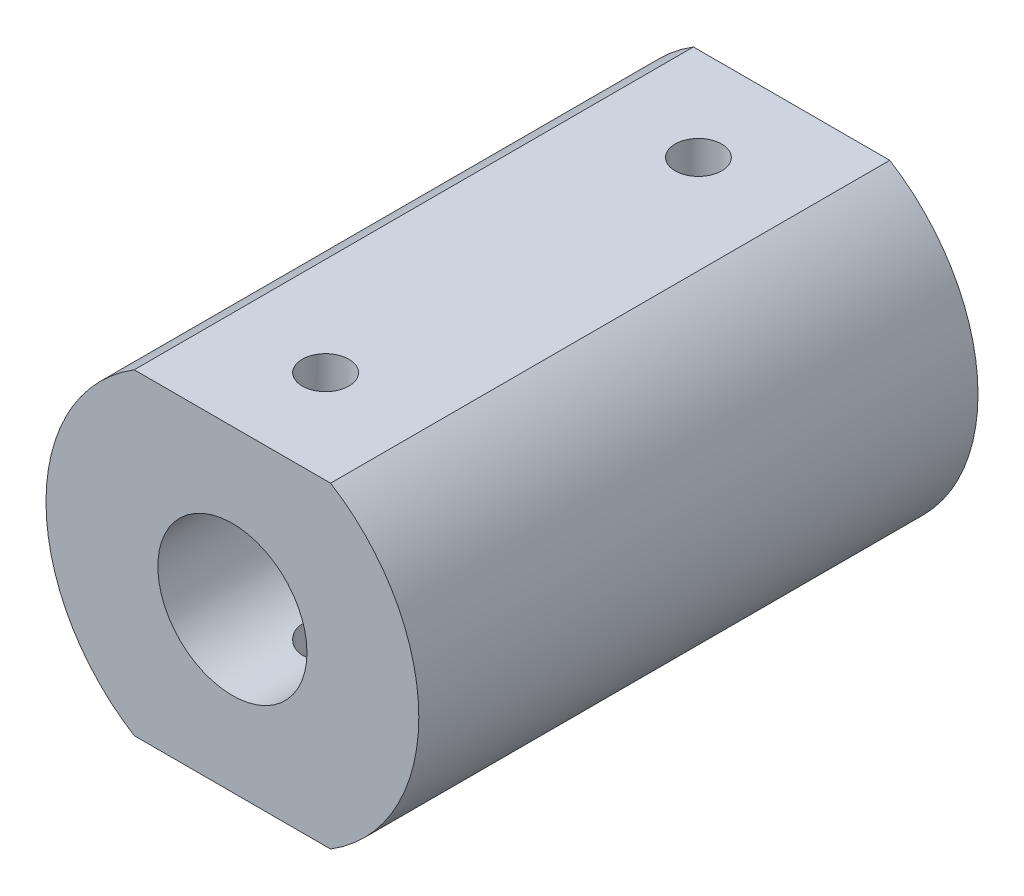
ISO-10303-21;
HEADER;
FILE_DESCRIPTION(('STEP AP214'),'2;1');
FILE_NAME('part.step','',(''),(''),'','','');
FILE_SCHEMA(('AUTOMOTIVE_DESIGN { 1 0 10303 214 1 1 1 1 }'));
ENDSEC;
DATA;
#1=APPLICATION_CONTEXT('core data for automotive mechanical design processes');
#2=APPLICATION_PROTOCOL_DEFINITION('international standard','automotive_design',2000,#1);
#3=PRODUCT_CONTEXT('',#1,'mechanical');
#4=PRODUCT('Part','Part','',(#3));
#5=PRODUCT_RELATED_PRODUCT_CATEGORY('part','',(#4));
#6=PRODUCT_DEFINITION_FORMATION('','',#4);
#7=PRODUCT_DEFINITION_CONTEXT('part definition',#1,'design');
#8=PRODUCT_DEFINITION('design','',#6,#7);
#9=PRODUCT_DEFINITION_SHAPE('','',#8);
#10=(LENGTH_UNIT() NAMED_UNIT(*) SI_UNIT(.MILLI.,.METRE.));
#11=(NAMED_UNIT(*) PLANE_ANGLE_UNIT() SI_UNIT($,.RADIAN.));
#12=(NAMED_UNIT(*) SI_UNIT($,.STERADIAN.) SOLID_ANGLE_UNIT());
#13=UNCERTAINTY_MEASURE_WITH_UNIT(LENGTH_MEASURE(1.E-05),#10,'distance_accuracy_value','');
#14=(GEOMETRIC_REPRESENTATION_CONTEXT(3) GLOBAL_UNCERTAINTY_ASSIGNED_CONTEXT((#13)) GLOBAL_UNIT_ASSIGNED_CONTEXT((#10,
#11,#12)) REPRESENTATION_CONTEXT('',''));
#15=CARTESIAN_POINT('',(0.,0.,0.));
#16=DIRECTION('',(0.,0.,1.));
#17=DIRECTION('',(1.,0.,0.));
#18=AXIS2_PLACEMENT_3D('',#15,#16,#17);
#19=CARTESIAN_POINT('',(0.,0.,60.));
#20=DIRECTION('',(0.,0.,-1.));
#21=DIRECTION('',(-1.,0.,0.));
#22=AXIS2_PLACEMENT_3D('',#19,#20,#21);
#23=CYLINDRICAL_SURFACE('',#22,20.);
#24=CARTESIAN_POINT('',(0.,0.,60.));
#25=DIRECTION('',(0.,0.,1.));
#26=DIRECTION('',(1.,0.,0.));
#27=AXIS2_PLACEMENT_3D('',#24,#25,#26);
#28=CIRCLE('',#27,20.);
#29=CARTESIAN_POINT('',(-10.5356537528527,17.,60.));
#30=VERTEX_POINT('',#29);
#31=CARTESIAN_POINT('',(-10.5356537528527,-17.,60.));
#32=VERTEX_POINT('',#31);
#33=EDGE_CURVE('E99',#30,#32,#28,.T.);
#34=ORIENTED_EDGE('',*,*,#33,.F.);
#35=DIRECTION('',(0.,0.,-1.));
#36=VECTOR('',#35,1.);
#37=CARTESIAN_POINT('',(-10.5356537528527,17.,60.));
#38=LINE('',#37,#36);
#39=CARTESIAN_POINT('',(-10.5356537528527,17.,0.));
#40=VERTEX_POINT('',#39);
#41=EDGE_CURVE('E11',#30,#40,#38,.T.);
#42=ORIENTED_EDGE('',*,*,#41,.T.);
#43=CARTESIAN_POINT('',(0.,0.,0.));
#44=DIRECTION('',(0.,0.,1.));
#45=DIRECTION('',(1.,0.,0.));
#46=AXIS2_PLACEMENT_3D('',#43,#44,#45);
#47=CIRCLE('',#46,20.);
#48=CARTESIAN_POINT('',(-10.5356537528527,-17.,0.));
#49=VERTEX_POINT('',#48);
#50=EDGE_CURVE('E102',#40,#49,#47,.T.);
#51=ORIENTED_EDGE('',*,*,#50,.T.);
#52=DIRECTION('',(0.,0.,-1.));
#53=VECTOR('',#52,1.);
#54=CARTESIAN_POINT('',(-10.5356537528527,-17.,60.));
#55=LINE('',#54,#53);
#56=EDGE_CURVE('E90',#49,#32,#55,.F.);
#57=ORIENTED_EDGE('',*,*,#56,.T.);
#58=EDGE_LOOP('',(#34,#42,#51,#57));
#59=FACE_BOUND('',#58,.T.);
#60=ADVANCED_FACE('F36',(#59),#23,.T.);
#61=CARTESIAN_POINT('',(0.,0.,60.));
#62=DIRECTION('',(0.,0.,1.));
#63=DIRECTION('',(1.,0.,0.));
#64=AXIS2_PLACEMENT_3D('',#61,#62,#63);
#65=PLANE('',#64);
#66=DIRECTION('',(1.,0.,0.));
#67=VECTOR('',#66,1.);
#68=CARTESIAN_POINT('',(-15.2086292755877,17.,60.));
#69=LINE('',#68,#67);
#70=CARTESIAN_POINT('',(10.5356537528527,17.,60.));
#71=VERTEX_POINT('',#70);
#72=EDGE_CURVE('E66',#30,#71,#69,.T.);
#73=ORIENTED_EDGE('',*,*,#72,.F.);
#74=ORIENTED_EDGE('',*,*,#33,.T.);
#75=DIRECTION('',(-1.,0.,0.));
#76=VECTOR('',#75,1.);
#77=CARTESIAN_POINT('',(-26.5951407746183,-17.,60.));
#78=LINE('',#77,#76);
#79=CARTESIAN_POINT('',(10.5356537528527,-17.,60.));
#80=VERTEX_POINT('',#79);
#81=EDGE_CURVE('E58',#80,#32,#78,.T.);
#82=ORIENTED_EDGE('',*,*,#81,.F.);
#83=EDGE_CURVE('E97',#80,#71,#28,.T.);
#84=ORIENTED_EDGE('',*,*,#83,.T.);
#85=EDGE_LOOP('',(#73,#74,#82,#84));
#86=FACE_BOUND('',#85,.T.);
#87=CARTESIAN_POINT('',(0.,0.,60.));
#88=DIRECTION('',(0.,0.,1.));
#89=DIRECTION('',(1.,0.,0.));
#90=AXIS2_PLACEMENT_3D('',#87,#88,#89);
#91=CIRCLE('',#90,8.);
#92=CARTESIAN_POINT('',(8.,0.,60.));
#93=VERTEX_POINT('',#92);
#94=EDGE_CURVE('E111',#93,#93,#91,.T.);
#95=ORIENTED_EDGE('',*,*,#94,.F.);
#96=EDGE_LOOP('',(#95));
#97=FACE_BOUND('',#96,.T.);
#98=ADVANCED_FACE('F95',(#86,#97),#65,.T.);
#99=CARTESIAN_POINT('',(0.,0.,0.));
#100=DIRECTION('',(0.,0.,1.));
#101=DIRECTION('',(1.,0.,0.));
#102=AXIS2_PLACEMENT_3D('',#99,#100,#101);
#103=PLANE('',#102);
#104=ORIENTED_EDGE('',*,*,#50,.F.);
#105=DIRECTION('',(1.,0.,0.));
#106=VECTOR('',#105,1.);
#107=CARTESIAN_POINT('',(-15.2086292755877,17.,0.));
#108=LINE('',#107,#106);
#109=CARTESIAN_POINT('',(10.5356537528527,17.,0.));
#110=VERTEX_POINT('',#109);
#111=EDGE_CURVE('E168',#40,#110,#108,.T.);
#112=ORIENTED_EDGE('',*,*,#111,.T.);
#113=CARTESIAN_POINT('',(10.5356537528527,-17.,0.));
#114=VERTEX_POINT('',#113);
#115=EDGE_CURVE('E105',#114,#110,#47,.T.);
#116=ORIENTED_EDGE('',*,*,#115,.F.);
#117=DIRECTION('',(-1.,0.,0.));
#118=VECTOR('',#117,1.);
#119=CARTESIAN_POINT('',(-26.5951407746183,-17.,0.));
#120=LINE('',#119,#118);
#121=EDGE_CURVE('E85',#114,#49,#120,.T.);
#122=ORIENTED_EDGE('',*,*,#121,.T.);
#123=EDGE_LOOP('',(#104,#112,#116,#122));
#124=FACE_BOUND('',#123,.T.);
#125=CARTESIAN_POINT('',(0.,0.,0.));
#126=DIRECTION('',(0.,0.,1.));
#127=DIRECTION('',(1.,0.,0.));
#128=AXIS2_PLACEMENT_3D('',#125,#126,#127);
#129=CIRCLE('',#128,8.);
#130=CARTESIAN_POINT('',(8.,0.,0.));
#131=VERTEX_POINT('',#130);
#132=EDGE_CURVE('E108',#131,#131,#129,.T.);
#133=ORIENTED_EDGE('',*,*,#132,.T.);
#134=EDGE_LOOP('',(#133));
#135=FACE_BOUND('',#134,.T.);
#136=ADVANCED_FACE('F154',(#124,#135),#103,.F.);
#137=ORIENTED_EDGE('',*,*,#115,.T.);
#138=DIRECTION('',(0.,0.,-1.));
#139=VECTOR('',#138,1.);
#140=CARTESIAN_POINT('',(10.5356537528527,17.,60.));
#141=LINE('',#140,#139);
#142=EDGE_CURVE('E50',#110,#71,#141,.F.);
#143=ORIENTED_EDGE('',*,*,#142,.T.);
#144=ORIENTED_EDGE('',*,*,#83,.F.);
#145=DIRECTION('',(0.,0.,-1.));
#146=VECTOR('',#145,1.);
#147=CARTESIAN_POINT('',(10.5356537528527,-17.,60.));
#148=LINE('',#147,#146);
#149=EDGE_CURVE('E82',#80,#114,#148,.T.);
#150=ORIENTED_EDGE('',*,*,#149,.T.);
#151=EDGE_LOOP('',(#137,#143,#144,#150));
#152=FACE_BOUND('',#151,.T.);
#153=ADVANCED_FACE('F38',(#152),#23,.T.);
#154=CARTESIAN_POINT('',(0.,0.,60.));
#155=DIRECTION('',(0.,0.,-1.));
#156=DIRECTION('',(-1.,0.,0.));
#157=AXIS2_PLACEMENT_3D('',#154,#155,#156);
#158=CYLINDRICAL_SURFACE('',#157,8.);
#159=CARTESIAN_POINT('',(0.,-8.,47.5));
#160=CARTESIAN_POINT('',(-0.136878370349092,-7.9999993175598,47.5000008931752));
#161=CARTESIAN_POINT('',(-0.273766105005717,-7.99645389969682,47.5112784538889));
#162=CARTESIAN_POINT('',(-0.543538419176894,-7.98265788177613,47.5559724830785));
#163=CARTESIAN_POINT('',(-0.676422085451812,-7.97240576399719,47.5893939627287));
#164=CARTESIAN_POINT('',(-0.93425708730161,-7.94631631395819,47.6771387423915));
#165=CARTESIAN_POINT('',(-1.0592203539716,-7.9304876299805,47.7314296893059));
#166=CARTESIAN_POINT('',(-1.29826960469292,-7.89487938322185,47.8592346353567));
#167=CARTESIAN_POINT('',(-1.41235387088976,-7.8750991979981,47.9327516635612));
#168=CARTESIAN_POINT('',(-1.62993066990455,-7.83300427480565,48.0993119840347));
#169=CARTESIAN_POINT('',(-1.73304005631331,-7.81063431853978,48.1928417701222));
#170=CARTESIAN_POINT('',(-1.92239476407398,-7.76620092748417,48.3957367848271));
#171=CARTESIAN_POINT('',(-2.00863694579738,-7.74413755046915,48.5051049549891));
#172=CARTESIAN_POINT('',(-2.16388672966226,-7.70222289396345,48.7398891276162));
#173=CARTESIAN_POINT('',(-2.23241568300257,-7.68243976603592,48.8656349550545));
#174=CARTESIAN_POINT('',(-2.34719482153342,-7.64815603598469,49.1275846299637));
#175=CARTESIAN_POINT('',(-2.39345087543888,-7.63365404257377,49.2637857115879));
#176=CARTESIAN_POINT('',(-2.46096919860066,-7.61215213969002,49.5384561549041));
#177=CARTESIAN_POINT('',(-2.48294220015728,-7.60493945859017,49.6767336872777));
#178=CARTESIAN_POINT('',(-2.50349110073975,-7.59820110281901,49.9551862378238));
#179=CARTESIAN_POINT('',(-2.50207321991543,-7.59867338454669,50.0953607416433));
#180=CARTESIAN_POINT('',(-2.47643649465477,-7.60706378150876,50.367748920538));
#181=CARTESIAN_POINT('',(-2.45312115738765,-7.61468683491898,50.5000582517231));
#182=CARTESIAN_POINT('',(-2.38581626711251,-7.63604051304978,50.7587843130747));
#183=CARTESIAN_POINT('',(-2.341824516891,-7.6497717868623,50.8852004154176));
#184=CARTESIAN_POINT('',(-2.23377749362553,-7.68202088028593,51.1307038888653));
#185=CARTESIAN_POINT('',(-2.16943851324163,-7.70060569321649,51.249657221384));
#186=CARTESIAN_POINT('',(-2.02272041475695,-7.7404371316014,51.4753755357582));
#187=CARTESIAN_POINT('',(-1.94033661043154,-7.76168444789102,51.5821373405074));
#188=CARTESIAN_POINT('',(-1.75543390836424,-7.80563055600986,51.785549886834));
#189=CARTESIAN_POINT('',(-1.65216914118563,-7.82835139211391,51.8815191155594));
#190=CARTESIAN_POINT('',(-1.43072881619105,-7.87183141519161,52.0549437871594));
#191=CARTESIAN_POINT('',(-1.31255215469803,-7.89259045676745,52.1323978584384));
#192=CARTESIAN_POINT('',(-1.0633292209309,-7.93002589780382,52.2670553772025));
#193=CARTESIAN_POINT('',(-0.93218981383855,-7.94666921296415,52.3240962709279));
#194=CARTESIAN_POINT('',(-0.661535955565281,-7.97375911657108,52.4151060017031));
#195=CARTESIAN_POINT('',(-0.522024061449211,-7.98420758650304,52.4490818444768));
#196=CARTESIAN_POINT('',(-0.244370314580686,-7.99742778790027,52.491836085158));
#197=CARTESIAN_POINT('',(-0.106383697577683,-8.00048045790873,52.501537087187));
#198=CARTESIAN_POINT('',(0.169260611465173,-7.99939599461967,52.4980675467253));
#199=CARTESIAN_POINT('',(0.306918348613019,-7.9952599116227,52.4849003453548));
#200=CARTESIAN_POINT('',(0.574438665951698,-7.98044727539523,52.4368088147872));
#201=CARTESIAN_POINT('',(0.704409956841873,-7.96993586221374,52.402433464775));
#202=CARTESIAN_POINT('',(0.956703857722752,-7.94360242758579,52.3135712952666));
#203=CARTESIAN_POINT('',(1.07902552089811,-7.92777975028688,52.25908199195));
#204=CARTESIAN_POINT('',(1.31586481334437,-7.89197085518848,52.1300535669026));
#205=CARTESIAN_POINT('',(1.43011947957558,-7.87189253635336,52.0550580250064));
#206=CARTESIAN_POINT('',(1.64473170192051,-7.82986820006859,51.8876935797651));
#207=CARTESIAN_POINT('',(1.74508547608789,-7.80792167695775,51.7953199645107));
#208=CARTESIAN_POINT('',(1.93317492583803,-7.76353989766283,51.5914822198958));
#209=CARTESIAN_POINT('',(2.02025304679062,-7.74111973412883,51.4794066725215));
#210=CARTESIAN_POINT('',(2.17442500490302,-7.69923894191212,51.2417467672464));
#211=CARTESIAN_POINT('',(2.24151915946858,-7.67977826622621,51.116162623946));
#212=CARTESIAN_POINT('',(2.35340166961084,-7.64623564661738,50.855309654259));
#213=CARTESIAN_POINT('',(2.39827639112024,-7.63213292713749,50.7200807011286));
#214=CARTESIAN_POINT('',(2.46445788636179,-7.61102341688621,50.4434550135027));
#215=CARTESIAN_POINT('',(2.48577362827988,-7.60401392602456,50.3020606473129));
#216=CARTESIAN_POINT('',(2.5035881231625,-7.59816585427754,50.0239918248392));
#217=CARTESIAN_POINT('',(2.5011655924327,-7.59897209200284,49.8873930923052));
#218=CARTESIAN_POINT('',(2.47417636257667,-7.60780180751807,49.6166508301161));
#219=CARTESIAN_POINT('',(2.44961069645023,-7.61582494863208,49.4825071862265));
#220=CARTESIAN_POINT('',(2.37975459827234,-7.6379362836678,49.2224119208162));
#221=CARTESIAN_POINT('',(2.33477284812015,-7.65193396380514,49.0963691178133));
#222=CARTESIAN_POINT('',(2.22560454669998,-7.68439408509128,48.853519172932));
#223=CARTESIAN_POINT('',(2.16141408888472,-7.70285743429344,48.7367139158432));
#224=CARTESIAN_POINT('',(2.01271350026985,-7.74306974067006,48.5107080591204));
#225=CARTESIAN_POINT('',(1.92750667048263,-7.76491897845914,48.4019837409995));
#226=CARTESIAN_POINT('',(1.74041799280959,-7.8089799764242,48.200027343776));
#227=CARTESIAN_POINT('',(1.63853168468877,-7.83119183213309,48.1067994220179));
#228=CARTESIAN_POINT('',(1.41697332564668,-7.87434543904947,47.9354349232741));
#229=CARTESIAN_POINT('',(1.29682914897476,-7.89522203461346,47.8578905271001));
#230=CARTESIAN_POINT('',(1.04455827602729,-7.93253538593756,47.7242021697211));
#231=CARTESIAN_POINT('',(0.912436315590892,-7.94897388631644,47.6680497957163));
#232=CARTESIAN_POINT('',(0.651495270747954,-7.97441301466941,47.5828172647831));
#233=CARTESIAN_POINT('',(0.523340674225089,-7.98392481612283,47.5518502653893));
#234=CARTESIAN_POINT('',(0.263459790880493,-7.99671800680967,47.5104432800646));
#235=CARTESIAN_POINT('',(0.131734232279349,-8.00000065679286,47.499999140392));
#236=CARTESIAN_POINT('',(0.,-8.,47.5));
#237=B_SPLINE_CURVE_WITH_KNOTS('',3,(#159,#160,#161,#162,#163,#164,#165,#166,#167,#168,#169,
#170,#171,#172,#173,#174,#175,#176,#177,#178,#179,#180,#181,#182,#183,#184,#185,#186,#187,#188,
#189,#190,#191,#192,#193,#194,#195,#196,#197,#198,#199,#200,#201,#202,#203,#204,#205,#206,#207,
#208,#209,#210,#211,#212,#213,#214,#215,#216,#217,#218,#219,#220,#221,#222,#223,#224,#225,#226,
#227,#228,#229,#230,#231,#232,#233,#234,#235,#236),.UNSPECIFIED.,.T.,.F.,(4,2,2,2,2,2,2,2,2,2,2,
2,2,2,2,2,2,2,2,2,2,2,2,2,2,2,2,2,2,2,2,2,2,2,2,2,2,2,4),(0.,0.410150898865018,0.82039464669813,
1.23000495840487,1.63967984311678,2.06075644390316,2.48191134862551,2.91347542494986,
3.34492572559053,3.76338300334419,4.18172900590275,4.58353834844336,4.98539039958124,
5.39311285441088,5.80094132020714,6.22733494559198,6.65376014826604,7.08350921379538,
7.51312768989105,7.92615137096472,8.33911471298723,8.74181253445741,9.14456010068996,
9.55712649476682,9.96980491418515,10.3988355742628,10.8278594196742,11.2552023150671,
11.6823824779468,12.0902440696665,12.4980866352126,12.8999582681243,13.3019116867944,
13.7195902803181,14.1373807476577,14.5688133627191,15.0000761335176,15.3948927332217,
15.7896294154518),.UNSPECIFIED.);
#238=CARTESIAN_POINT('',(0.,-8.,47.5));
#239=VERTEX_POINT('',#238);
#240=EDGE_CURVE('E40',#239,#239,#237,.T.);
#241=ORIENTED_EDGE('',*,*,#240,.F.);
#242=EDGE_LOOP('',(#241));
#243=FACE_BOUND('',#242,.T.);
#244=CARTESIAN_POINT('',(0.,-8.,27.5));
#245=CARTESIAN_POINT('',(-0.136878370349092,-7.9999993175598,27.5000008931752));
#246=CARTESIAN_POINT('',(-0.273766105005718,-7.99645389969682,27.5112784538889));
#247=CARTESIAN_POINT('',(-0.543538419176894,-7.98265788177613,27.5559724830785));
#248=CARTESIAN_POINT('',(-0.676422085451812,-7.97240576399719,27.5893939627287));
#249=CARTESIAN_POINT('',(-0.934257087301609,-7.94631631395819,27.6771387423915));
#250=CARTESIAN_POINT('',(-1.0592203539716,-7.9304876299805,27.7314296893059));
#251=CARTESIAN_POINT('',(-1.29826960469291,-7.89487938322185,27.8592346353567));
#252=CARTESIAN_POINT('',(-1.41235387088976,-7.8750991979981,27.9327516635612));
#253=CARTESIAN_POINT('',(-1.62993066990455,-7.83300427480565,28.0993119840347));
#254=CARTESIAN_POINT('',(-1.73304005631331,-7.81063431853978,28.1928417701222));
#255=CARTESIAN_POINT('',(-1.92239476407398,-7.76620092748417,28.3957367848271));
#256=CARTESIAN_POINT('',(-2.00863694579738,-7.74413755046915,28.5051049549891));
#257=CARTESIAN_POINT('',(-2.16388672966226,-7.70222289396345,28.7398891276162));
#258=CARTESIAN_POINT('',(-2.23241568300257,-7.68243976603592,28.8656349550544));
#259=CARTESIAN_POINT('',(-2.34719482153342,-7.64815603598469,29.1275846299637));
#260=CARTESIAN_POINT('',(-2.39345087543888,-7.63365404257377,29.2637857115879));
#261=CARTESIAN_POINT('',(-2.46096919860066,-7.61215213969002,29.5384561549041));
#262=CARTESIAN_POINT('',(-2.48294220015728,-7.60493945859017,29.6767336872777));
#263=CARTESIAN_POINT('',(-2.50349110073975,-7.59820110281901,29.9551862378238));
#264=CARTESIAN_POINT('',(-2.50207321991543,-7.59867338454669,30.0953607416433));
#265=CARTESIAN_POINT('',(-2.47643649465478,-7.60706378150876,30.367748920538));
#266=CARTESIAN_POINT('',(-2.45312115738765,-7.61468683491897,30.5000582517231));
#267=CARTESIAN_POINT('',(-2.38581626711251,-7.63604051304978,30.7587843130747));
#268=CARTESIAN_POINT('',(-2.341824516891,-7.6497717868623,30.8852004154176));
#269=CARTESIAN_POINT('',(-2.23377749362554,-7.68202088028593,31.1307038888653));
#270=CARTESIAN_POINT('',(-2.16943851324163,-7.70060569321649,31.249657221384));
#271=CARTESIAN_POINT('',(-2.02272041475696,-7.7404371316014,31.4753755357582));
#272=CARTESIAN_POINT('',(-1.94033661043154,-7.76168444789102,31.5821373405074));
#273=CARTESIAN_POINT('',(-1.75543390836424,-7.80563055600986,31.785549886834));
#274=CARTESIAN_POINT('',(-1.65216914118563,-7.82835139211391,31.8815191155594));
#275=CARTESIAN_POINT('',(-1.43072881619105,-7.87183141519161,32.0549437871594));
#276=CARTESIAN_POINT('',(-1.31255215469803,-7.89259045676745,32.1323978584384));
#277=CARTESIAN_POINT('',(-1.0633292209309,-7.93002589780382,32.2670553772025));
#278=CARTESIAN_POINT('',(-0.932189813838554,-7.94666921296415,32.3240962709279));
#279=CARTESIAN_POINT('',(-0.661535955565285,-7.97375911657108,32.4151060017031));
#280=CARTESIAN_POINT('',(-0.522024061449214,-7.98420758650304,32.4490818444768));
#281=CARTESIAN_POINT('',(-0.244370314580688,-7.99742778790027,32.4918360851579));
#282=CARTESIAN_POINT('',(-0.106383697577685,-8.00048045790873,32.501537087187));
#283=CARTESIAN_POINT('',(0.169260611465171,-7.99939599461967,32.4980675467253));
#284=CARTESIAN_POINT('',(0.306918348613017,-7.9952599116227,32.4849003453548));
#285=CARTESIAN_POINT('',(0.574438665951695,-7.98044727539523,32.4368088147872));
#286=CARTESIAN_POINT('',(0.70440995684187,-7.96993586221374,32.402433464775));
#287=CARTESIAN_POINT('',(0.95670385772275,-7.94360242758579,32.3135712952666));
#288=CARTESIAN_POINT('',(1.07902552089811,-7.92777975028688,32.25908199195));
#289=CARTESIAN_POINT('',(1.31586481334437,-7.89197085518848,32.1300535669026));
#290=CARTESIAN_POINT('',(1.43011947957558,-7.87189253635335,32.0550580250064));
#291=CARTESIAN_POINT('',(1.64473170192051,-7.82986820006859,31.8876935797651));
#292=CARTESIAN_POINT('',(1.74508547608789,-7.80792167695775,31.7953199645107));
#293=CARTESIAN_POINT('',(1.93317492583803,-7.76353989766283,31.5914822198958));
#294=CARTESIAN_POINT('',(2.02025304679062,-7.74111973412883,31.4794066725215));
#295=CARTESIAN_POINT('',(2.17442500490302,-7.69923894191212,31.2417467672464));
#296=CARTESIAN_POINT('',(2.24151915946858,-7.67977826622621,31.116162623946));
#297=CARTESIAN_POINT('',(2.35340166961084,-7.64623564661738,30.855309654259));
#298=CARTESIAN_POINT('',(2.39827639112024,-7.63213292713749,30.7200807011286));
#299=CARTESIAN_POINT('',(2.46445788636179,-7.61102341688621,30.4434550135028));
#300=CARTESIAN_POINT('',(2.48577362827988,-7.60401392602456,30.3020606473129));
#301=CARTESIAN_POINT('',(2.5035881231625,-7.59816585427754,30.0239918248391));
#302=CARTESIAN_POINT('',(2.5011655924327,-7.59897209200284,29.8873930923052));
#303=CARTESIAN_POINT('',(2.47417636257667,-7.60780180751807,29.6166508301161));
#304=CARTESIAN_POINT('',(2.44961069645023,-7.61582494863208,29.4825071862265));
#305=CARTESIAN_POINT('',(2.37975459827234,-7.6379362836678,29.2224119208162));
#306=CARTESIAN_POINT('',(2.33477284812016,-7.65193396380514,29.0963691178133));
#307=CARTESIAN_POINT('',(2.22560454669998,-7.68439408509128,28.853519172932));
#308=CARTESIAN_POINT('',(2.16141408888473,-7.70285743429343,28.7367139158432));
#309=CARTESIAN_POINT('',(2.01271350026986,-7.74306974067006,28.5107080591204));
#310=CARTESIAN_POINT('',(1.92750667048264,-7.76491897845914,28.4019837409995));
#311=CARTESIAN_POINT('',(1.74041799280959,-7.8089799764242,28.200027343776));
#312=CARTESIAN_POINT('',(1.63853168468877,-7.83119183213309,28.1067994220179));
#313=CARTESIAN_POINT('',(1.41697332564669,-7.87434543904947,27.9354349232741));
#314=CARTESIAN_POINT('',(1.29682914897476,-7.89522203461346,27.8578905271001));
#315=CARTESIAN_POINT('',(1.0445582760273,-7.93253538593756,27.7242021697211));
#316=CARTESIAN_POINT('',(0.912436315590893,-7.94897388631644,27.6680497957163));
#317=CARTESIAN_POINT('',(0.651495270747953,-7.97441301466941,27.5828172647831));
#318=CARTESIAN_POINT('',(0.523340674225089,-7.98392481612283,27.5518502653893));
#319=CARTESIAN_POINT('',(0.263459790880493,-7.99671800680967,27.5104432800646));
#320=CARTESIAN_POINT('',(0.131734232279348,-8.00000065679286,27.499999140392));
#321=CARTESIAN_POINT('',(0.,-8.,27.5));
#322=B_SPLINE_CURVE_WITH_KNOTS('',3,(#244,#245,#246,#247,#248,#249,#250,#251,#252,#253,#254,
#255,#256,#257,#258,#259,#260,#261,#262,#263,#264,#265,#266,#267,#268,#269,#270,#271,#272,#273,
#274,#275,#276,#277,#278,#279,#280,#281,#282,#283,#284,#285,#286,#287,#288,#289,#290,#291,#292,
#293,#294,#295,#296,#297,#298,#299,#300,#301,#302,#303,#304,#305,#306,#307,#308,#309,#310,#311,
#312,#313,#314,#315,#316,#317,#318,#319,#320,#321),.UNSPECIFIED.,.T.,.F.,(4,2,2,2,2,2,2,2,2,2,2,
2,2,2,2,2,2,2,2,2,2,2,2,2,2,2,2,2,2,2,2,2,2,2,2,2,2,2,4),(0.,0.410150898865018,
0.820394646698129,1.23000495840487,1.63967984311677,2.06075644390316,2.48191134862551,
2.91347542494987,3.34492572559053,3.76338300334418,4.18172900590275,4.58353834844336,
4.98539039958124,5.39311285441088,5.80094132020714,6.22733494559198,6.65376014826604,
7.08350921379537,7.51312768989105,7.92615137096471,8.33911471298722,8.7418125344574,
9.14456010068996,9.55712649476683,9.96980491418514,10.3988355742628,10.8278594196742,
11.2552023150671,11.6823824779467,12.0902440696665,12.4980866352126,12.8999582681243,
13.3019116867944,13.7195902803181,14.1373807476577,14.5688133627191,15.0000761335176,
15.3948927332217,15.7896294154518),.UNSPECIFIED.);
#323=CARTESIAN_POINT('',(0.,-8.,27.5));
#324=VERTEX_POINT('',#323);
#325=EDGE_CURVE('E179',#324,#324,#322,.T.);
#326=ORIENTED_EDGE('',*,*,#325,.F.);
#327=EDGE_LOOP('',(#326));
#328=FACE_BOUND('',#327,.T.);
#329=CARTESIAN_POINT('',(0.,8.,52.5));
#330=CARTESIAN_POINT('',(-0.136878370349092,7.9999993175598,52.4999991068248));
#331=CARTESIAN_POINT('',(-0.273766105005717,7.99645389969682,52.4887215461111));
#332=CARTESIAN_POINT('',(-0.543538419176894,7.98265788177613,52.4440275169215));
#333=CARTESIAN_POINT('',(-0.676422085451812,7.97240576399719,52.4106060372713));
#334=CARTESIAN_POINT('',(-0.934257087301611,7.94631631395819,52.3228612576085));
#335=CARTESIAN_POINT('',(-1.0592203539716,7.9304876299805,52.2685703106941));
#336=CARTESIAN_POINT('',(-1.29826960469292,7.89487938322185,52.1407653646433));
#337=CARTESIAN_POINT('',(-1.41235387088976,7.8750991979981,52.0672483364388));
#338=CARTESIAN_POINT('',(-1.62993066990456,7.83300427480565,51.9006880159653));
#339=CARTESIAN_POINT('',(-1.73304005631331,7.81063431853978,51.8071582298778));
#340=CARTESIAN_POINT('',(-1.92239476407398,7.76620092748417,51.6042632151729));
#341=CARTESIAN_POINT('',(-2.00863694579739,7.74413755046915,51.4948950450109));
#342=CARTESIAN_POINT('',(-2.16388672966227,7.70222289396345,51.2601108723838));
#343=CARTESIAN_POINT('',(-2.23241568300258,7.68243976603591,51.1343650449455));
#344=CARTESIAN_POINT('',(-2.34719482153343,7.64815603598469,50.8724153700362));
#345=CARTESIAN_POINT('',(-2.39345087543889,7.63365404257377,50.7362142884121));
#346=CARTESIAN_POINT('',(-2.46096919860066,7.61215213969002,50.4615438450959));
#347=CARTESIAN_POINT('',(-2.48294220015729,7.60493945859017,50.3232663127223));
#348=CARTESIAN_POINT('',(-2.50349110073976,7.59820110281901,50.0448137621762));
#349=CARTESIAN_POINT('',(-2.50207321991543,7.59867338454669,49.9046392583567));
#350=CARTESIAN_POINT('',(-2.47643649465478,7.60706378150876,49.632251079462));
#351=CARTESIAN_POINT('',(-2.45312115738765,7.61468683491897,49.4999417482769));
#352=CARTESIAN_POINT('',(-2.38581626711252,7.63604051304978,49.2412156869253));
#353=CARTESIAN_POINT('',(-2.341824516891,7.6497717868623,49.1147995845824));
#354=CARTESIAN_POINT('',(-2.23377749362554,7.68202088028593,48.8692961111347));
#355=CARTESIAN_POINT('',(-2.16943851324163,7.70060569321649,48.750342778616));
#356=CARTESIAN_POINT('',(-2.02272041475696,7.7404371316014,48.5246244642418));
#357=CARTESIAN_POINT('',(-1.94033661043154,7.76168444789102,48.4178626594926));
#358=CARTESIAN_POINT('',(-1.75543390836425,7.80563055600986,48.214450113166));
#359=CARTESIAN_POINT('',(-1.65216914118563,7.82835139211391,48.1184808844406));
#360=CARTESIAN_POINT('',(-1.43072881619106,7.87183141519161,47.9450562128406));
#361=CARTESIAN_POINT('',(-1.31255215469804,7.89259045676745,47.8676021415616));
#362=CARTESIAN_POINT('',(-1.06332922093091,7.93002589780382,47.7329446227975));
#363=CARTESIAN_POINT('',(-0.932189813838558,7.94666921296415,47.6759037290721));
#364=CARTESIAN_POINT('',(-0.661535955565288,7.97375911657108,47.5848939982969));
#365=CARTESIAN_POINT('',(-0.522024061449216,7.98420758650304,47.5509181555232));
#366=CARTESIAN_POINT('',(-0.24437031458069,7.99742778790027,47.508163914842));
#367=CARTESIAN_POINT('',(-0.106383697577687,8.00048045790873,47.4984629128129));
#368=CARTESIAN_POINT('',(0.169260611465169,7.99939599461967,47.5019324532747));
#369=CARTESIAN_POINT('',(0.306918348613015,7.9952599116227,47.5150996546452));
#370=CARTESIAN_POINT('',(0.574438665951694,7.98044727539523,47.5631911852128));
#371=CARTESIAN_POINT('',(0.704409956841869,7.96993586221374,47.597566535225));
#372=CARTESIAN_POINT('',(0.956703857722749,7.94360242758579,47.6864287047334));
#373=CARTESIAN_POINT('',(1.07902552089811,7.92777975028688,47.74091800805));
#374=CARTESIAN_POINT('',(1.31586481334437,7.89197085518848,47.8699464330974));
#375=CARTESIAN_POINT('',(1.43011947957558,7.87189253635335,47.9449419749936));
#376=CARTESIAN_POINT('',(1.64473170192051,7.82986820006859,48.1123064202348));
#377=CARTESIAN_POINT('',(1.74508547608789,7.80792167695775,48.2046800354893));
#378=CARTESIAN_POINT('',(1.93317492583803,7.76353989766283,48.4085177801042));
#379=CARTESIAN_POINT('',(2.02025304679062,7.74111973412883,48.5205933274784));
#380=CARTESIAN_POINT('',(2.17442500490302,7.69923894191212,48.7582532327535));
#381=CARTESIAN_POINT('',(2.24151915946859,7.67977826622621,48.883837376054));
#382=CARTESIAN_POINT('',(2.35340166961084,7.64623564661738,49.1446903457409));
#383=CARTESIAN_POINT('',(2.39827639112024,7.63213292713749,49.2799192988714));
#384=CARTESIAN_POINT('',(2.4644578863618,7.6110234168862,49.5565449864972));
#385=CARTESIAN_POINT('',(2.48577362827988,7.60401392602456,49.6979393526871));
#386=CARTESIAN_POINT('',(2.50358812316251,7.59816585427754,49.9760081751609));
#387=CARTESIAN_POINT('',(2.50116559243271,7.59897209200284,50.1126069076948));
#388=CARTESIAN_POINT('',(2.47417636257667,7.60780180751807,50.3833491698839));
#389=CARTESIAN_POINT('',(2.44961069645024,7.61582494863208,50.5174928137735));
#390=CARTESIAN_POINT('',(2.37975459827234,7.6379362836678,50.7775880791838));
#391=CARTESIAN_POINT('',(2.33477284812016,7.65193396380514,50.9036308821867));
#392=CARTESIAN_POINT('',(2.22560454669998,7.68439408509128,51.146480827068));
#393=CARTESIAN_POINT('',(2.16141408888473,7.70285743429343,51.2632860841568));
#394=CARTESIAN_POINT('',(2.01271350026986,7.74306974067005,51.4892919408796));
#395=CARTESIAN_POINT('',(1.92750667048264,7.76491897845914,51.5980162590005));
#396=CARTESIAN_POINT('',(1.74041799280959,7.8089799764242,51.799972656224));
#397=CARTESIAN_POINT('',(1.63853168468877,7.83119183213309,51.8932005779821));
#398=CARTESIAN_POINT('',(1.41697332564669,7.87434543904947,52.0645650767259));
#399=CARTESIAN_POINT('',(1.29682914897476,7.89522203461346,52.1421094728999));
#400=CARTESIAN_POINT('',(1.0445582760273,7.93253538593756,52.2757978302789));
#401=CARTESIAN_POINT('',(0.912436315590893,7.94897388631644,52.3319502042837));
#402=CARTESIAN_POINT('',(0.651495270747954,7.97441301466941,52.4171827352169));
#403=CARTESIAN_POINT('',(0.52334067422509,7.98392481612283,52.4481497346107));
#404=CARTESIAN_POINT('',(0.263459790880494,7.99671800680967,52.4895567199354));
#405=CARTESIAN_POINT('',(0.131734232279349,8.00000065679286,52.500000859608));
#406=CARTESIAN_POINT('',(0.,8.,52.5));
#407=B_SPLINE_CURVE_WITH_KNOTS('',3,(#329,#330,#331,#332,#333,#334,#335,#336,#337,#338,#339,
#340,#341,#342,#343,#344,#345,#346,#347,#348,#349,#350,#351,#352,#353,#354,#355,#356,#357,#358,
#359,#360,#361,#362,#363,#364,#365,#366,#367,#368,#369,#370,#371,#372,#373,#374,#375,#376,#377,
#378,#379,#380,#381,#382,#383,#384,#385,#386,#387,#388,#389,#390,#391,#392,#393,#394,#395,#396,
#397,#398,#399,#400,#401,#402,#403,#404,#405,#406),.UNSPECIFIED.,.T.,.F.,(4,2,2,2,2,2,2,2,2,2,2,
2,2,2,2,2,2,2,2,2,2,2,2,2,2,2,2,2,2,2,2,2,2,2,2,2,2,2,4),(0.,0.410150898865018,0.82039464669813,
1.23000495840487,1.63967984311678,2.06075644390316,2.48191134862552,2.91347542494989,
3.34492572559053,3.7633830033442,4.18172900590276,4.58353834844337,4.98539039958124,
5.39311285441088,5.80094132020715,6.22733494559199,6.65376014826604,7.08350921379539,
7.51312768989106,7.92615137096473,8.33911471298724,8.74181253445742,9.14456010068997,
9.55712649476684,9.96980491418516,10.3988355742628,10.8278594196742,11.2552023150671,
11.6823824779468,12.0902440696666,12.4980866352126,12.8999582681244,13.3019116867944,
13.7195902803182,14.1373807476577,14.5688133627192,15.0000761335177,15.3948927332217,
15.7896294154519),.UNSPECIFIED.);
#408=CARTESIAN_POINT('',(0.,8.,52.5));
#409=VERTEX_POINT('',#408);
#410=EDGE_CURVE('E121',#409,#409,#407,.T.);
#411=ORIENTED_EDGE('',*,*,#410,.F.);
#412=EDGE_LOOP('',(#411));
#413=FACE_BOUND('',#412,.T.);
#414=CARTESIAN_POINT('',(0.,8.,12.5));
#415=CARTESIAN_POINT('',(-0.136878370349093,7.9999993175598,12.4999991068249));
#416=CARTESIAN_POINT('',(-0.273766105005718,7.99645389969682,12.4887215461111));
#417=CARTESIAN_POINT('',(-0.543538419176895,7.98265788177613,12.4440275169215));
#418=CARTESIAN_POINT('',(-0.676422085451813,7.97240576399719,12.4106060372713));
#419=CARTESIAN_POINT('',(-0.934257087301611,7.94631631395819,12.3228612576085));
#420=CARTESIAN_POINT('',(-1.05922035397161,7.9304876299805,12.2685703106941));
#421=CARTESIAN_POINT('',(-1.29826960469292,7.89487938322185,12.1407653646433));
#422=CARTESIAN_POINT('',(-1.41235387088977,7.8750991979981,12.0672483364388));
#423=CARTESIAN_POINT('',(-1.62993066990456,7.83300427480565,11.9006880159653));
#424=CARTESIAN_POINT('',(-1.73304005631332,7.81063431853978,11.8071582298779));
#425=CARTESIAN_POINT('',(-1.92239476407398,7.76620092748417,11.6042632151729));
#426=CARTESIAN_POINT('',(-2.00863694579739,7.74413755046915,11.4948950450109));
#427=CARTESIAN_POINT('',(-2.16388672966227,7.70222289396345,11.2601108723838));
#428=CARTESIAN_POINT('',(-2.23241568300257,7.68243976603592,11.1343650449456));
#429=CARTESIAN_POINT('',(-2.34719482153343,7.64815603598469,10.8724153700363));
#430=CARTESIAN_POINT('',(-2.39345087543889,7.63365404257377,10.7362142884121));
#431=CARTESIAN_POINT('',(-2.46096919860066,7.61215213969002,10.4615438450959));
#432=CARTESIAN_POINT('',(-2.48294220015729,7.60493945859017,10.3232663127223));
#433=CARTESIAN_POINT('',(-2.50349110073976,7.59820110281901,10.0448137621762));
#434=CARTESIAN_POINT('',(-2.50207321991543,7.59867338454669,9.90463925835668));
#435=CARTESIAN_POINT('',(-2.47643649465478,7.60706378150876,9.63225107946204));
#436=CARTESIAN_POINT('',(-2.45312115738765,7.61468683491897,9.49994174827688));
#437=CARTESIAN_POINT('',(-2.38581626711251,7.63604051304978,9.24121568692532));
#438=CARTESIAN_POINT('',(-2.341824516891,7.6497717868623,9.11479958458241));
#439=CARTESIAN_POINT('',(-2.23377749362554,7.68202088028593,8.86929611113474));
#440=CARTESIAN_POINT('',(-2.16943851324163,7.70060569321649,8.75034277861605));
#441=CARTESIAN_POINT('',(-2.02272041475696,7.7404371316014,8.52462446424176));
#442=CARTESIAN_POINT('',(-1.94033661043154,7.76168444789102,8.41786265949259));
#443=CARTESIAN_POINT('',(-1.75543390836424,7.80563055600986,8.21445011316603));
#444=CARTESIAN_POINT('',(-1.65216914118563,7.82835139211391,8.11848088444065));
#445=CARTESIAN_POINT('',(-1.43072881619106,7.87183141519161,7.94505621284065));
#446=CARTESIAN_POINT('',(-1.31255215469804,7.89259045676745,7.8676021415616));
#447=CARTESIAN_POINT('',(-1.0633292209309,7.93002589780382,7.73294462279746));
#448=CARTESIAN_POINT('',(-0.932189813838555,7.94666921296415,7.67590372907207));
#449=CARTESIAN_POINT('',(-0.661535955565286,7.97375911657108,7.58489399829688));
#450=CARTESIAN_POINT('',(-0.522024061449214,7.98420758650304,7.55091815552322));
#451=CARTESIAN_POINT('',(-0.244370314580688,7.99742778790027,7.50816391484205));
#452=CARTESIAN_POINT('',(-0.106383697577684,8.00048045790873,7.49846291281296));
#453=CARTESIAN_POINT('',(0.169260611465173,7.99939599461967,7.50193245327468));
#454=CARTESIAN_POINT('',(0.306918348613018,7.9952599116227,7.51509965464524));
#455=CARTESIAN_POINT('',(0.574438665951698,7.98044727539523,7.56319118521279));
#456=CARTESIAN_POINT('',(0.704409956841873,7.96993586221374,7.59756653522499));
#457=CARTESIAN_POINT('',(0.956703857722753,7.94360242758579,7.68642870473345));
#458=CARTESIAN_POINT('',(1.07902552089812,7.92777975028687,7.74091800805004));
#459=CARTESIAN_POINT('',(1.31586481334437,7.89197085518848,7.86994643309739));
#460=CARTESIAN_POINT('',(1.43011947957558,7.87189253635335,7.94494197499364));
#461=CARTESIAN_POINT('',(1.64473170192052,7.82986820006859,8.11230642023486));
#462=CARTESIAN_POINT('',(1.7450854760879,7.80792167695774,8.2046800354893));
#463=CARTESIAN_POINT('',(1.93317492583803,7.76353989766283,8.40851778010421));
#464=CARTESIAN_POINT('',(2.02025304679062,7.74111973412883,8.52059332747846));
#465=CARTESIAN_POINT('',(2.17442500490302,7.69923894191212,8.75825323275356));
#466=CARTESIAN_POINT('',(2.24151915946859,7.67977826622621,8.88383737605398));
#467=CARTESIAN_POINT('',(2.35340166961084,7.64623564661738,9.14469034574097));
#468=CARTESIAN_POINT('',(2.39827639112025,7.63213292713749,9.27991929887146));
#469=CARTESIAN_POINT('',(2.4644578863618,7.6110234168862,9.55654498649725));
#470=CARTESIAN_POINT('',(2.48577362827989,7.60401392602456,9.69793935268708));
#471=CARTESIAN_POINT('',(2.50358812316251,7.59816585427754,9.97600817516087));
#472=CARTESIAN_POINT('',(2.50116559243271,7.59897209200284,10.1126069076948));
#473=CARTESIAN_POINT('',(2.47417636257667,7.60780180751807,10.3833491698839));
#474=CARTESIAN_POINT('',(2.44961069645024,7.61582494863208,10.5174928137735));
#475=CARTESIAN_POINT('',(2.37975459827234,7.6379362836678,10.7775880791838));
#476=CARTESIAN_POINT('',(2.33477284812016,7.65193396380514,10.9036308821867));
#477=CARTESIAN_POINT('',(2.22560454669998,7.68439408509128,11.146480827068));
#478=CARTESIAN_POINT('',(2.16141408888473,7.70285743429343,11.2632860841568));
#479=CARTESIAN_POINT('',(2.01271350026986,7.74306974067005,11.4892919408796));
#480=CARTESIAN_POINT('',(1.92750667048264,7.76491897845913,11.5980162590005));
#481=CARTESIAN_POINT('',(1.74041799280959,7.8089799764242,11.799972656224));
#482=CARTESIAN_POINT('',(1.63853168468877,7.83119183213309,11.8932005779821));
#483=CARTESIAN_POINT('',(1.41697332564669,7.87434543904947,12.0645650767259));
#484=CARTESIAN_POINT('',(1.29682914897476,7.89522203461346,12.1421094728999));
#485=CARTESIAN_POINT('',(1.0445582760273,7.93253538593756,12.2757978302789));
#486=CARTESIAN_POINT('',(0.912436315590892,7.94897388631644,12.3319502042837));
#487=CARTESIAN_POINT('',(0.651495270747953,7.97441301466941,12.4171827352169));
#488=CARTESIAN_POINT('',(0.523340674225089,7.98392481612283,12.4481497346107));
#489=CARTESIAN_POINT('',(0.263459790880493,7.99671800680967,12.4895567199354));
#490=CARTESIAN_POINT('',(0.131734232279348,8.00000065679286,12.500000859608));
#491=CARTESIAN_POINT('',(0.,8.,12.5));
#492=B_SPLINE_CURVE_WITH_KNOTS('',3,(#414,#415,#416,#417,#418,#419,#420,#421,#422,#423,#424,
#425,#426,#427,#428,#429,#430,#431,#432,#433,#434,#435,#436,#437,#438,#439,#440,#441,#442,#443,
#444,#445,#446,#447,#448,#449,#450,#451,#452,#453,#454,#455,#456,#457,#458,#459,#460,#461,#462,
#463,#464,#465,#466,#467,#468,#469,#470,#471,#472,#473,#474,#475,#476,#477,#478,#479,#480,#481,
#482,#483,#484,#485,#486,#487,#488,#489,#490,#491),.UNSPECIFIED.,.T.,.F.,(4,2,2,2,2,2,2,2,2,2,2,
2,2,2,2,2,2,2,2,2,2,2,2,2,2,2,2,2,2,2,2,2,2,2,2,2,2,2,4),(0.,0.410150898865019,
0.820394646698131,1.23000495840487,1.63967984311678,2.06075644390316,2.48191134862552,
2.91347542494987,3.34492572559053,3.76338300334419,4.18172900590276,4.58353834844337,
4.98539039958125,5.39311285441089,5.80094132020716,6.22733494559199,6.65376014826605,
7.08350921379539,7.51312768989106,7.92615137096473,8.33911471298724,8.74181253445742,
9.14456010068998,9.55712649476684,9.96980491418517,10.3988355742628,10.8278594196742,
11.2552023150671,11.6823824779468,12.0902440696665,12.4980866352126,12.8999582681244,
13.3019116867944,13.7195902803182,14.1373807476577,14.5688133627192,15.0000761335177,
15.3948927332217,15.7896294154519),.UNSPECIFIED.);
#493=CARTESIAN_POINT('',(0.,8.,12.5));
#494=VERTEX_POINT('',#493);
#495=EDGE_CURVE('E100',#494,#494,#492,.T.);
#496=ORIENTED_EDGE('',*,*,#495,.F.);
#497=EDGE_LOOP('',(#496));
#498=FACE_BOUND('',#497,.T.);
#499=ORIENTED_EDGE('',*,*,#94,.T.);
#500=EDGE_LOOP('',(#499));
#501=FACE_BOUND('',#500,.T.);
#502=ORIENTED_EDGE('',*,*,#132,.F.);
#503=EDGE_LOOP('',(#502));
#504=FACE_BOUND('',#503,.T.);
#505=ADVANCED_FACE('F126',(#243,#328,#413,#498,#501,#504),#158,.F.);
#506=CARTESIAN_POINT('',(-26.5951407746183,-17.,0.));
#507=DIRECTION('',(0.,1.,0.));
#508=DIRECTION('',(0.,0.,1.));
#509=AXIS2_PLACEMENT_3D('',#506,#507,#508);
#510=PLANE('',#509);
#511=CARTESIAN_POINT('',(0.,-17.,50.));
#512=DIRECTION('',(0.,-1.,0.));
#513=DIRECTION('',(0.,0.,-1.));
#514=AXIS2_PLACEMENT_3D('',#511,#512,#513);
#515=CIRCLE('',#514,2.49999999999999);
#516=CARTESIAN_POINT('',(0.,-17.,47.5));
#517=VERTEX_POINT('',#516);
#518=EDGE_CURVE('E183',#517,#517,#515,.T.);
#519=ORIENTED_EDGE('',*,*,#518,.F.);
#520=EDGE_LOOP('',(#519));
#521=FACE_BOUND('',#520,.T.);
#522=CARTESIAN_POINT('',(0.,-17.,30.));
#523=DIRECTION('',(0.,-1.,0.));
#524=DIRECTION('',(0.,0.,-1.));
#525=AXIS2_PLACEMENT_3D('',#522,#523,#524);
#526=CIRCLE('',#525,2.49999999999999);
#527=CARTESIAN_POINT('',(0.,-17.,27.5));
#528=VERTEX_POINT('',#527);
#529=EDGE_CURVE('E180',#528,#528,#526,.T.);
#530=ORIENTED_EDGE('',*,*,#529,.F.);
#531=EDGE_LOOP('',(#530));
#532=FACE_BOUND('',#531,.T.);
#533=ORIENTED_EDGE('',*,*,#81,.T.);
#534=ORIENTED_EDGE('',*,*,#56,.F.);
#535=ORIENTED_EDGE('',*,*,#121,.F.);
#536=ORIENTED_EDGE('',*,*,#149,.F.);
#537=EDGE_LOOP('',(#533,#534,#535,#536));
#538=FACE_BOUND('',#537,.T.);
#539=ADVANCED_FACE('F83',(#521,#532,#538),#510,.F.);
#540=CARTESIAN_POINT('',(-15.2086292755877,17.,0.));
#541=DIRECTION('',(0.,-1.,0.));
#542=DIRECTION('',(0.,0.,-1.));
#543=AXIS2_PLACEMENT_3D('',#540,#541,#542);
#544=PLANE('',#543);
#545=CARTESIAN_POINT('',(0.,17.,50.));
#546=DIRECTION('',(0.,1.,0.));
#547=DIRECTION('',(0.,0.,1.));
#548=AXIS2_PLACEMENT_3D('',#545,#546,#547);
#549=CIRCLE('',#548,2.49999999999999);
#550=CARTESIAN_POINT('',(0.,17.,52.5));
#551=VERTEX_POINT('',#550);
#552=EDGE_CURVE('E176',#551,#551,#549,.T.);
#553=ORIENTED_EDGE('',*,*,#552,.F.);
#554=EDGE_LOOP('',(#553));
#555=FACE_BOUND('',#554,.T.);
#556=CARTESIAN_POINT('',(0.,17.,10.));
#557=DIRECTION('',(0.,1.,0.));
#558=DIRECTION('',(0.,0.,1.));
#559=AXIS2_PLACEMENT_3D('',#556,#557,#558);
#560=CIRCLE('',#559,2.49999999999999);
#561=CARTESIAN_POINT('',(0.,17.,12.5));
#562=VERTEX_POINT('',#561);
#563=EDGE_CURVE('E120',#562,#562,#560,.T.);
#564=ORIENTED_EDGE('',*,*,#563,.F.);
#565=EDGE_LOOP('',(#564));
#566=FACE_BOUND('',#565,.T.);
#567=ORIENTED_EDGE('',*,*,#72,.T.);
#568=ORIENTED_EDGE('',*,*,#142,.F.);
#569=ORIENTED_EDGE('',*,*,#111,.F.);
#570=ORIENTED_EDGE('',*,*,#41,.F.);
#571=EDGE_LOOP('',(#567,#568,#569,#570));
#572=FACE_BOUND('',#571,.T.);
#573=ADVANCED_FACE('F135',(#555,#566,#572),#544,.F.);
#574=CARTESIAN_POINT('',(0.,17.,10.));
#575=DIRECTION('',(0.,1.,0.));
#576=DIRECTION('',(0.,0.,1.));
#577=AXIS2_PLACEMENT_3D('',#574,#575,#576);
#578=CYLINDRICAL_SURFACE('',#577,2.49999999999999);
#579=ORIENTED_EDGE('',*,*,#495,.T.);
#580=EDGE_LOOP('',(#579));
#581=FACE_BOUND('',#580,.T.);
#582=ORIENTED_EDGE('',*,*,#563,.T.);
#583=EDGE_LOOP('',(#582));
#584=FACE_BOUND('',#583,.T.);
#585=ADVANCED_FACE('F130',(#581,#584),#578,.F.);
#586=CARTESIAN_POINT('',(0.,17.,50.));
#587=DIRECTION('',(0.,1.,0.));
#588=DIRECTION('',(0.,0.,1.));
#589=AXIS2_PLACEMENT_3D('',#586,#587,#588);
#590=CYLINDRICAL_SURFACE('',#589,2.49999999999999);
#591=ORIENTED_EDGE('',*,*,#410,.T.);
#592=EDGE_LOOP('',(#591));
#593=FACE_BOUND('',#592,.T.);
#594=ORIENTED_EDGE('',*,*,#552,.T.);
#595=EDGE_LOOP('',(#594));
#596=FACE_BOUND('',#595,.T.);
#597=ADVANCED_FACE('F134',(#593,#596),#590,.F.);
#598=CARTESIAN_POINT('',(0.,-17.,30.));
#599=DIRECTION('',(0.,-1.,0.));
#600=DIRECTION('',(0.,0.,-1.));
#601=AXIS2_PLACEMENT_3D('',#598,#599,#600);
#602=CYLINDRICAL_SURFACE('',#601,2.49999999999999);
#603=ORIENTED_EDGE('',*,*,#325,.T.);
#604=EDGE_LOOP('',(#603));
#605=FACE_BOUND('',#604,.T.);
#606=ORIENTED_EDGE('',*,*,#529,.T.);
#607=EDGE_LOOP('',(#606));
#608=FACE_BOUND('',#607,.T.);
#609=ADVANCED_FACE('F206',(#605,#608),#602,.F.);
#610=CARTESIAN_POINT('',(0.,-17.,50.));
#611=DIRECTION('',(0.,-1.,0.));
#612=DIRECTION('',(0.,0.,-1.));
#613=AXIS2_PLACEMENT_3D('',#610,#611,#612);
#614=CYLINDRICAL_SURFACE('',#613,2.49999999999999);
#615=ORIENTED_EDGE('',*,*,#240,.T.);
#616=EDGE_LOOP('',(#615));
#617=FACE_BOUND('',#616,.T.);
#618=ORIENTED_EDGE('',*,*,#518,.T.);
#619=EDGE_LOOP('',(#618));
#620=FACE_BOUND('',#619,.T.);
#621=ADVANCED_FACE('F189',(#617,#620),#614,.F.);
#622=CLOSED_SHELL('',(#60,#98,#136,#153,#505,#539,#573,#585,#597,#609,#621));
#623=MANIFOLD_SOLID_BREP('B2',#622);
#624=ADVANCED_BREP_SHAPE_REPRESENTATION('',(#18,#623),#14);
#625=SHAPE_DEFINITION_REPRESENTATION(#9,#624);
ENDSEC;
END-ISO-10303-21;
